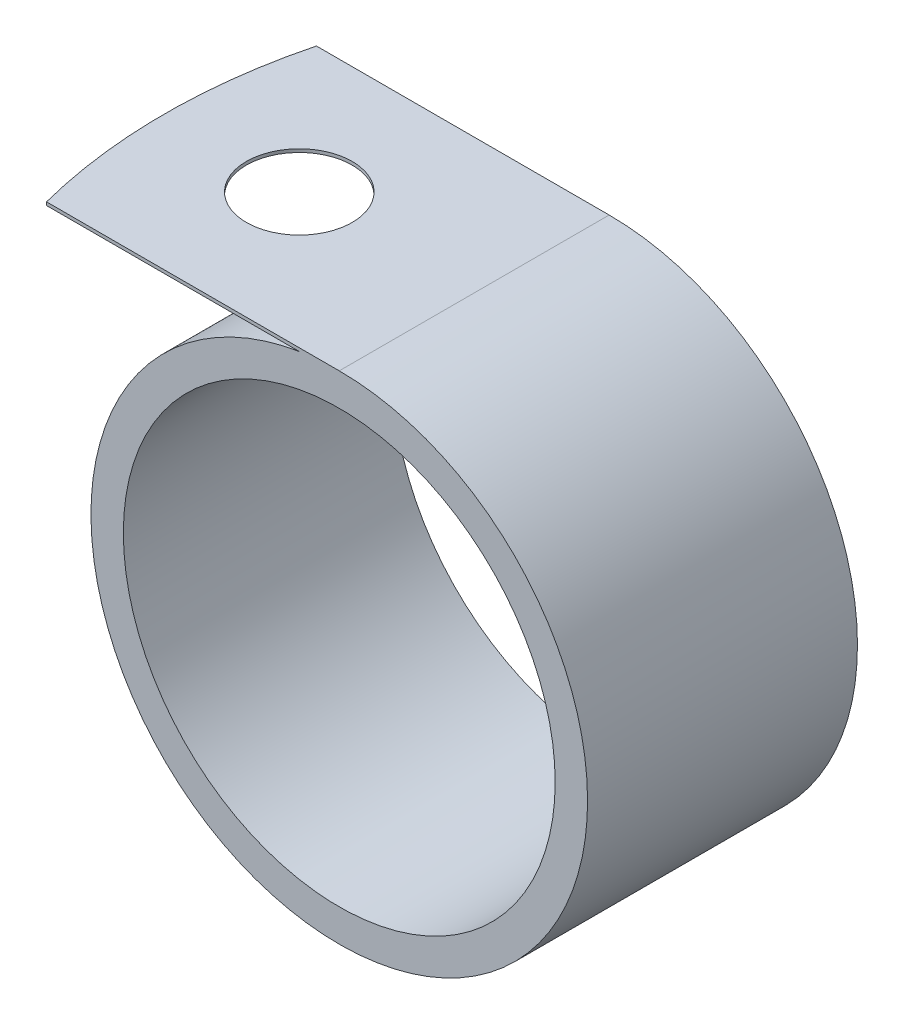
ISO-10303-21;
HEADER;
FILE_DESCRIPTION(('STEP AP214'),'2;1');
FILE_NAME('part.step','',(''),(''),'','','');
FILE_SCHEMA(('AUTOMOTIVE_DESIGN { 1 0 10303 214 1 1 1 1 }'));
ENDSEC;
DATA;
#1=APPLICATION_CONTEXT('core data for automotive mechanical design processes');
#2=APPLICATION_PROTOCOL_DEFINITION('international standard','automotive_design',2000,#1);
#3=PRODUCT_CONTEXT('',#1,'mechanical');
#4=PRODUCT('Part','Part','',(#3));
#5=PRODUCT_RELATED_PRODUCT_CATEGORY('part','',(#4));
#6=PRODUCT_DEFINITION_FORMATION('','',#4);
#7=PRODUCT_DEFINITION_CONTEXT('part definition',#1,'design');
#8=PRODUCT_DEFINITION('design','',#6,#7);
#9=PRODUCT_DEFINITION_SHAPE('','',#8);
#10=(LENGTH_UNIT() NAMED_UNIT(*) SI_UNIT(.MILLI.,.METRE.));
#11=(NAMED_UNIT(*) PLANE_ANGLE_UNIT() SI_UNIT($,.RADIAN.));
#12=(NAMED_UNIT(*) SI_UNIT($,.STERADIAN.) SOLID_ANGLE_UNIT());
#13=UNCERTAINTY_MEASURE_WITH_UNIT(LENGTH_MEASURE(1.E-05),#10,'distance_accuracy_value','');
#14=(GEOMETRIC_REPRESENTATION_CONTEXT(3) GLOBAL_UNCERTAINTY_ASSIGNED_CONTEXT((#13)) GLOBAL_UNIT_ASSIGNED_CONTEXT((#10,
#11,#12)) REPRESENTATION_CONTEXT('',''));
#15=CARTESIAN_POINT('',(0.,0.,0.));
#16=DIRECTION('',(0.,0.,1.));
#17=DIRECTION('',(1.,0.,0.));
#18=AXIS2_PLACEMENT_3D('',#15,#16,#17);
#19=CARTESIAN_POINT('',(0.,11.684,6.35));
#20=DIRECTION('',(0.,-1.,0.));
#21=DIRECTION('',(0.,0.,-1.));
#22=AXIS2_PLACEMENT_3D('',#19,#20,#21);
#23=PLANE('',#22);
#24=CARTESIAN_POINT('',(-8.23097247188788,11.684,0.));
#25=DIRECTION('',(0.,1.,0.));
#26=DIRECTION('',(-1.,0.,0.));
#27=AXIS2_PLACEMENT_3D('',#24,#25,#26);
#28=CIRCLE('',#27,2.4892);
#29=CARTESIAN_POINT('',(-10.7201724718879,11.684,0.));
#30=VERTEX_POINT('',#29);
#31=EDGE_CURVE('E103',#30,#30,#28,.T.);
#32=ORIENTED_EDGE('',*,*,#31,.F.);
#33=EDGE_LOOP('',(#32));
#34=FACE_BOUND('',#33,.T.);
#35=CARTESIAN_POINT('',(10.8190275281121,11.684,0.));
#36=DIRECTION('',(0.,1.,0.));
#37=DIRECTION('',(-1.,0.,0.));
#38=AXIS2_PLACEMENT_3D('',#35,#36,#37);
#39=CIRCLE('',#38,25.4);
#40=CARTESIAN_POINT('',(-13.774416720305,11.684,-6.35));
#41=VERTEX_POINT('',#40);
#42=CARTESIAN_POINT('',(-13.774416720305,11.684,6.35));
#43=VERTEX_POINT('',#42);
#44=EDGE_CURVE('E107',#41,#43,#39,.T.);
#45=ORIENTED_EDGE('',*,*,#44,.T.);
#46=DIRECTION('',(-1.,0.,0.));
#47=VECTOR('',#46,1.);
#48=CARTESIAN_POINT('',(0.,11.684,6.35));
#49=LINE('',#48,#47);
#50=CARTESIAN_POINT('',(0.,11.684,6.35));
#51=VERTEX_POINT('',#50);
#52=EDGE_CURVE('E94',#51,#43,#49,.T.);
#53=ORIENTED_EDGE('',*,*,#52,.F.);
#54=DIRECTION('',(0.,0.,-1.));
#55=VECTOR('',#54,1.);
#56=CARTESIAN_POINT('',(0.,11.684,6.35));
#57=LINE('',#56,#55);
#58=CARTESIAN_POINT('',(0.,11.684,-6.35));
#59=VERTEX_POINT('',#58);
#60=EDGE_CURVE('E11',#51,#59,#57,.T.);
#61=ORIENTED_EDGE('',*,*,#60,.T.);
#62=DIRECTION('',(-1.,0.,0.));
#63=VECTOR('',#62,1.);
#64=CARTESIAN_POINT('',(0.,11.684,-6.35));
#65=LINE('',#64,#63);
#66=EDGE_CURVE('E78',#59,#41,#65,.T.);
#67=ORIENTED_EDGE('',*,*,#66,.T.);
#68=EDGE_LOOP('',(#45,#53,#61,#67));
#69=FACE_BOUND('',#68,.T.);
#70=ADVANCED_FACE('F33',(#34,#69),#23,.F.);
#71=CARTESIAN_POINT('',(-14.5809724718879,11.5316,6.35));
#72=DIRECTION('',(0.,1.,0.));
#73=DIRECTION('',(0.,0.,1.));
#74=AXIS2_PLACEMENT_3D('',#71,#72,#73);
#75=PLANE('',#74);
#76=CARTESIAN_POINT('',(-8.23097247188788,11.5316,0.));
#77=DIRECTION('',(0.,1.,0.));
#78=DIRECTION('',(0.,0.,1.));
#79=AXIS2_PLACEMENT_3D('',#76,#77,#78);
#80=CIRCLE('',#79,2.4892);
#81=CARTESIAN_POINT('',(-8.23097247188788,11.5316,2.4892));
#82=VERTEX_POINT('',#81);
#83=EDGE_CURVE('E99',#82,#82,#80,.F.);
#84=ORIENTED_EDGE('',*,*,#83,.F.);
#85=EDGE_LOOP('',(#84));
#86=FACE_BOUND('',#85,.T.);
#87=DIRECTION('',(1.,0.,0.));
#88=VECTOR('',#87,1.);
#89=CARTESIAN_POINT('',(-14.5809724718879,11.5316,6.35));
#90=LINE('',#89,#88);
#91=CARTESIAN_POINT('',(-13.774416720305,11.5316,6.35));
#92=VERTEX_POINT('',#91);
#93=CARTESIAN_POINT('',(-1.88097247188788,11.5316,6.35));
#94=VERTEX_POINT('',#93);
#95=EDGE_CURVE('E57',#92,#94,#90,.T.);
#96=ORIENTED_EDGE('',*,*,#95,.F.);
#97=CARTESIAN_POINT('',(10.8190275281121,11.5316,0.));
#98=DIRECTION('',(0.,1.,0.));
#99=DIRECTION('',(0.,0.,1.));
#100=AXIS2_PLACEMENT_3D('',#97,#98,#99);
#101=CIRCLE('',#100,25.4);
#102=CARTESIAN_POINT('',(-13.774416720305,11.5316,-6.35));
#103=VERTEX_POINT('',#102);
#104=EDGE_CURVE('E74',#92,#103,#101,.F.);
#105=ORIENTED_EDGE('',*,*,#104,.T.);
#106=DIRECTION('',(1.,0.,0.));
#107=VECTOR('',#106,1.);
#108=CARTESIAN_POINT('',(-14.5809724718879,11.5316,-6.35));
#109=LINE('',#108,#107);
#110=CARTESIAN_POINT('',(-1.88097247188788,11.5316,-6.35));
#111=VERTEX_POINT('',#110);
#112=EDGE_CURVE('E70',#103,#111,#109,.T.);
#113=ORIENTED_EDGE('',*,*,#112,.T.);
#114=DIRECTION('',(0.,0.,-1.));
#115=VECTOR('',#114,1.);
#116=CARTESIAN_POINT('',(-1.88097247188788,11.5316,6.35));
#117=LINE('',#116,#115);
#118=EDGE_CURVE('E41',#94,#111,#117,.T.);
#119=ORIENTED_EDGE('',*,*,#118,.F.);
#120=EDGE_LOOP('',(#96,#105,#113,#119));
#121=FACE_BOUND('',#120,.T.);
#122=ADVANCED_FACE('F72',(#86,#121),#75,.F.);
#123=CARTESIAN_POINT('',(0.,0.,6.35));
#124=DIRECTION('',(0.,0.,1.));
#125=DIRECTION('',(1.,0.,0.));
#126=AXIS2_PLACEMENT_3D('',#123,#124,#125);
#127=PLANE('',#126);
#128=CARTESIAN_POINT('',(0.,0.,6.35));
#129=DIRECTION('',(0.,0.,1.));
#130=DIRECTION('',(1.,0.,0.));
#131=AXIS2_PLACEMENT_3D('',#128,#129,#130);
#132=CIRCLE('',#131,10.16);
#133=CARTESIAN_POINT('',(10.16,0.,6.35));
#134=VERTEX_POINT('',#133);
#135=EDGE_CURVE('E86',#134,#134,#132,.T.);
#136=ORIENTED_EDGE('',*,*,#135,.F.);
#137=EDGE_LOOP('',(#136));
#138=FACE_BOUND('',#137,.T.);
#139=ORIENTED_EDGE('',*,*,#52,.T.);
#140=DIRECTION('',(0.,1.,0.));
#141=VECTOR('',#140,1.);
#142=CARTESIAN_POINT('',(-13.774416720305,-11.685,6.35));
#143=LINE('',#142,#141);
#144=EDGE_CURVE('E111',#92,#43,#143,.T.);
#145=ORIENTED_EDGE('',*,*,#144,.F.);
#146=ORIENTED_EDGE('',*,*,#95,.T.);
#147=CARTESIAN_POINT('',(0.,0.,6.35));
#148=DIRECTION('',(0.,0.,1.));
#149=DIRECTION('',(1.,0.,0.));
#150=AXIS2_PLACEMENT_3D('',#147,#148,#149);
#151=CIRCLE('',#150,11.684);
#152=EDGE_CURVE('E77',#94,#51,#151,.T.);
#153=ORIENTED_EDGE('',*,*,#152,.T.);
#154=EDGE_LOOP('',(#139,#145,#146,#153));
#155=FACE_BOUND('',#154,.T.);
#156=ADVANCED_FACE('F117',(#138,#155),#127,.T.);
#157=CARTESIAN_POINT('',(0.,0.,-6.35));
#158=DIRECTION('',(0.,0.,1.));
#159=DIRECTION('',(1.,0.,0.));
#160=AXIS2_PLACEMENT_3D('',#157,#158,#159);
#161=PLANE('',#160);
#162=CARTESIAN_POINT('',(0.,0.,-6.35));
#163=DIRECTION('',(0.,0.,1.));
#164=DIRECTION('',(1.,0.,0.));
#165=AXIS2_PLACEMENT_3D('',#162,#163,#164);
#166=CIRCLE('',#165,10.16);
#167=CARTESIAN_POINT('',(10.16,0.,-6.35));
#168=VERTEX_POINT('',#167);
#169=EDGE_CURVE('E90',#168,#168,#166,.T.);
#170=ORIENTED_EDGE('',*,*,#169,.T.);
#171=EDGE_LOOP('',(#170));
#172=FACE_BOUND('',#171,.T.);
#173=DIRECTION('',(0.,1.,0.));
#174=VECTOR('',#173,1.);
#175=CARTESIAN_POINT('',(-13.774416720305,-11.685,-6.35));
#176=LINE('',#175,#174);
#177=EDGE_CURVE('E48',#103,#41,#176,.T.);
#178=ORIENTED_EDGE('',*,*,#177,.T.);
#179=ORIENTED_EDGE('',*,*,#66,.F.);
#180=CARTESIAN_POINT('',(0.,0.,-6.35));
#181=DIRECTION('',(0.,0.,1.));
#182=DIRECTION('',(1.,0.,0.));
#183=AXIS2_PLACEMENT_3D('',#180,#181,#182);
#184=CIRCLE('',#183,11.684);
#185=EDGE_CURVE('E83',#111,#59,#184,.T.);
#186=ORIENTED_EDGE('',*,*,#185,.F.);
#187=ORIENTED_EDGE('',*,*,#112,.F.);
#188=EDGE_LOOP('',(#178,#179,#186,#187));
#189=FACE_BOUND('',#188,.T.);
#190=ADVANCED_FACE('F84',(#172,#189),#161,.F.);
#191=CARTESIAN_POINT('',(0.,0.,6.35));
#192=DIRECTION('',(0.,0.,-1.));
#193=DIRECTION('',(-1.,0.,0.));
#194=AXIS2_PLACEMENT_3D('',#191,#192,#193);
#195=CYLINDRICAL_SURFACE('',#194,11.684);
#196=ORIENTED_EDGE('',*,*,#185,.T.);
#197=ORIENTED_EDGE('',*,*,#60,.F.);
#198=ORIENTED_EDGE('',*,*,#152,.F.);
#199=ORIENTED_EDGE('',*,*,#118,.T.);
#200=EDGE_LOOP('',(#196,#197,#198,#199));
#201=FACE_BOUND('',#200,.T.);
#202=ADVANCED_FACE('F35',(#201),#195,.T.);
#203=CARTESIAN_POINT('',(0.,0.,6.35));
#204=DIRECTION('',(0.,0.,-1.));
#205=DIRECTION('',(-1.,0.,0.));
#206=AXIS2_PLACEMENT_3D('',#203,#204,#205);
#207=CYLINDRICAL_SURFACE('',#206,10.16);
#208=ORIENTED_EDGE('',*,*,#135,.T.);
#209=EDGE_LOOP('',(#208));
#210=FACE_BOUND('',#209,.T.);
#211=ORIENTED_EDGE('',*,*,#169,.F.);
#212=EDGE_LOOP('',(#211));
#213=FACE_BOUND('',#212,.T.);
#214=ADVANCED_FACE('F135',(#210,#213),#207,.F.);
#215=CARTESIAN_POINT('',(-8.23097247188788,-11.685,0.));
#216=DIRECTION('',(0.,1.,0.));
#217=DIRECTION('',(-1.,0.,0.));
#218=AXIS2_PLACEMENT_3D('',#215,#216,#217);
#219=CYLINDRICAL_SURFACE('',#218,2.4892);
#220=ORIENTED_EDGE('',*,*,#31,.T.);
#221=EDGE_LOOP('',(#220));
#222=FACE_BOUND('',#221,.T.);
#223=ORIENTED_EDGE('',*,*,#83,.T.);
#224=EDGE_LOOP('',(#223));
#225=FACE_BOUND('',#224,.T.);
#226=ADVANCED_FACE('F138',(#222,#225),#219,.F.);
#227=CARTESIAN_POINT('',(10.8190275281121,-11.685,0.));
#228=DIRECTION('',(0.,1.,0.));
#229=DIRECTION('',(-1.,0.,0.));
#230=AXIS2_PLACEMENT_3D('',#227,#228,#229);
#231=CYLINDRICAL_SURFACE('',#230,25.4);
#232=ORIENTED_EDGE('',*,*,#104,.F.);
#233=ORIENTED_EDGE('',*,*,#144,.T.);
#234=ORIENTED_EDGE('',*,*,#44,.F.);
#235=ORIENTED_EDGE('',*,*,#177,.F.);
#236=EDGE_LOOP('',(#232,#233,#234,#235));
#237=FACE_BOUND('',#236,.T.);
#238=ADVANCED_FACE('F114',(#237),#231,.T.);
#239=CLOSED_SHELL('',(#70,#122,#156,#190,#202,#214,#226,#238));
#240=MANIFOLD_SOLID_BREP('B2',#239);
#241=ADVANCED_BREP_SHAPE_REPRESENTATION('',(#18,#240),#14);
#242=SHAPE_DEFINITION_REPRESENTATION(#9,#241);
ENDSEC;
END-ISO-10303-21;
